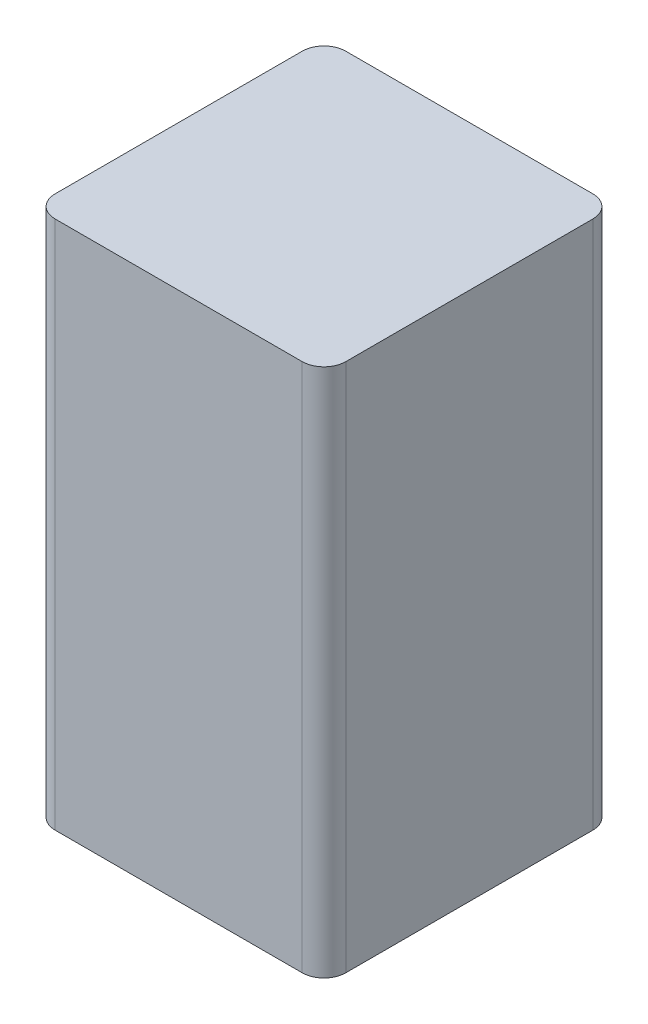
ISO-10303-21;
HEADER;
FILE_DESCRIPTION(('STEP AP214'),'2;1');
FILE_NAME('part.step','',(''),(''),'','','');
FILE_SCHEMA(('AUTOMOTIVE_DESIGN { 1 0 10303 214 1 1 1 1 }'));
ENDSEC;
DATA;
#1=APPLICATION_CONTEXT('core data for automotive mechanical design processes');
#2=APPLICATION_PROTOCOL_DEFINITION('international standard','automotive_design',2000,#1);
#3=PRODUCT_CONTEXT('',#1,'mechanical');
#4=PRODUCT('Part','Part','',(#3));
#5=PRODUCT_RELATED_PRODUCT_CATEGORY('part','',(#4));
#6=PRODUCT_DEFINITION_FORMATION('','',#4);
#7=PRODUCT_DEFINITION_CONTEXT('part definition',#1,'design');
#8=PRODUCT_DEFINITION('design','',#6,#7);
#9=PRODUCT_DEFINITION_SHAPE('','',#8);
#10=(LENGTH_UNIT() NAMED_UNIT(*) SI_UNIT(.MILLI.,.METRE.));
#11=(NAMED_UNIT(*) PLANE_ANGLE_UNIT() SI_UNIT($,.RADIAN.));
#12=(NAMED_UNIT(*) SI_UNIT($,.STERADIAN.) SOLID_ANGLE_UNIT());
#13=UNCERTAINTY_MEASURE_WITH_UNIT(LENGTH_MEASURE(1.E-05),#10,'distance_accuracy_value','');
#14=(GEOMETRIC_REPRESENTATION_CONTEXT(3) GLOBAL_UNCERTAINTY_ASSIGNED_CONTEXT((#13)) GLOBAL_UNIT_ASSIGNED_CONTEXT((#10,
#11,#12)) REPRESENTATION_CONTEXT('',''));
#15=CARTESIAN_POINT('',(0.,0.,0.));
#16=DIRECTION('',(0.,0.,1.));
#17=DIRECTION('',(1.,0.,0.));
#18=AXIS2_PLACEMENT_3D('',#15,#16,#17);
#19=CARTESIAN_POINT('',(0.,72.85,40.));
#20=DIRECTION('',(1.,0.,0.));
#21=DIRECTION('',(0.,0.,-1.));
#22=AXIS2_PLACEMENT_3D('',#19,#20,#21);
#23=PLANE('',#22);
#24=DIRECTION('',(0.,0.,-1.));
#25=VECTOR('',#24,1.);
#26=CARTESIAN_POINT('',(0.,72.85,40.));
#27=LINE('',#26,#25);
#28=CARTESIAN_POINT('',(0.,72.85,37.));
#29=VERTEX_POINT('',#28);
#30=CARTESIAN_POINT('',(0.,72.85,3.));
#31=VERTEX_POINT('',#30);
#32=EDGE_CURVE('E160',#29,#31,#27,.T.);
#33=ORIENTED_EDGE('',*,*,#32,.T.);
#34=DIRECTION('',(0.,-1.,0.));
#35=VECTOR('',#34,1.);
#36=CARTESIAN_POINT('',(0.,72.85,3.));
#37=LINE('',#36,#35);
#38=CARTESIAN_POINT('',(0.,0.,3.));
#39=VERTEX_POINT('',#38);
#40=EDGE_CURVE('E124',#31,#39,#37,.T.);
#41=ORIENTED_EDGE('',*,*,#40,.T.);
#42=DIRECTION('',(0.,0.,-1.));
#43=VECTOR('',#42,1.);
#44=CARTESIAN_POINT('',(0.,0.,40.));
#45=LINE('',#44,#43);
#46=CARTESIAN_POINT('',(0.,0.,37.));
#47=VERTEX_POINT('',#46);
#48=EDGE_CURVE('E109',#47,#39,#45,.T.);
#49=ORIENTED_EDGE('',*,*,#48,.F.);
#50=DIRECTION('',(0.,-1.,0.));
#51=VECTOR('',#50,1.);
#52=CARTESIAN_POINT('',(0.,72.85,37.));
#53=LINE('',#52,#51);
#54=EDGE_CURVE('E121',#47,#29,#53,.F.);
#55=ORIENTED_EDGE('',*,*,#54,.T.);
#56=EDGE_LOOP('',(#33,#41,#49,#55));
#57=FACE_BOUND('',#56,.T.);
#58=ADVANCED_FACE('F39',(#57),#23,.F.);
#59=CARTESIAN_POINT('',(0.,0.,40.));
#60=DIRECTION('',(0.,1.,0.));
#61=DIRECTION('',(0.,0.,1.));
#62=AXIS2_PLACEMENT_3D('',#59,#60,#61);
#63=PLANE('',#62);
#64=CARTESIAN_POINT('',(20.,0.,20.));
#65=DIRECTION('',(0.,-1.,0.));
#66=DIRECTION('',(0.,0.,-1.));
#67=AXIS2_PLACEMENT_3D('',#64,#65,#66);
#68=CIRCLE('',#67,4.15);
#69=CARTESIAN_POINT('',(20.,0.,15.85));
#70=VERTEX_POINT('',#69);
#71=EDGE_CURVE('E313',#70,#70,#68,.T.);
#72=ORIENTED_EDGE('',*,*,#71,.F.);
#73=EDGE_LOOP('',(#72));
#74=FACE_BOUND('',#73,.T.);
#75=ORIENTED_EDGE('',*,*,#48,.T.);
#76=CARTESIAN_POINT('',(3.,0.,3.));
#77=DIRECTION('',(0.,1.,0.));
#78=DIRECTION('',(0.,0.,1.));
#79=AXIS2_PLACEMENT_3D('',#76,#77,#78);
#80=CIRCLE('',#79,3.);
#81=CARTESIAN_POINT('',(3.,0.,0.));
#82=VERTEX_POINT('',#81);
#83=EDGE_CURVE('E136',#39,#82,#80,.F.);
#84=ORIENTED_EDGE('',*,*,#83,.T.);
#85=DIRECTION('',(1.,0.,0.));
#86=VECTOR('',#85,1.);
#87=CARTESIAN_POINT('',(0.,0.,0.));
#88=LINE('',#87,#86);
#89=CARTESIAN_POINT('',(37.,0.,0.));
#90=VERTEX_POINT('',#89);
#91=EDGE_CURVE('E168',#82,#90,#88,.T.);
#92=ORIENTED_EDGE('',*,*,#91,.T.);
#93=CARTESIAN_POINT('',(37.,0.,3.));
#94=DIRECTION('',(0.,1.,0.));
#95=DIRECTION('',(0.,0.,1.));
#96=AXIS2_PLACEMENT_3D('',#93,#94,#95);
#97=CIRCLE('',#96,3.);
#98=CARTESIAN_POINT('',(40.,0.,3.));
#99=VERTEX_POINT('',#98);
#100=EDGE_CURVE('E115',#90,#99,#97,.F.);
#101=ORIENTED_EDGE('',*,*,#100,.T.);
#102=DIRECTION('',(0.,0.,-1.));
#103=VECTOR('',#102,1.);
#104=CARTESIAN_POINT('',(40.,0.,40.));
#105=LINE('',#104,#103);
#106=CARTESIAN_POINT('',(40.,0.,37.));
#107=VERTEX_POINT('',#106);
#108=EDGE_CURVE('E125',#107,#99,#105,.T.);
#109=ORIENTED_EDGE('',*,*,#108,.F.);
#110=CARTESIAN_POINT('',(37.,0.,37.));
#111=DIRECTION('',(0.,1.,0.));
#112=DIRECTION('',(0.,0.,1.));
#113=AXIS2_PLACEMENT_3D('',#110,#111,#112);
#114=CIRCLE('',#113,3.);
#115=CARTESIAN_POINT('',(37.,0.,40.));
#116=VERTEX_POINT('',#115);
#117=EDGE_CURVE('E116',#107,#116,#114,.F.);
#118=ORIENTED_EDGE('',*,*,#117,.T.);
#119=DIRECTION('',(1.,0.,0.));
#120=VECTOR('',#119,1.);
#121=CARTESIAN_POINT('',(0.,0.,40.));
#122=LINE('',#121,#120);
#123=CARTESIAN_POINT('',(3.,0.,40.));
#124=VERTEX_POINT('',#123);
#125=EDGE_CURVE('E111',#124,#116,#122,.T.);
#126=ORIENTED_EDGE('',*,*,#125,.F.);
#127=CARTESIAN_POINT('',(3.,0.,37.));
#128=DIRECTION('',(0.,1.,0.));
#129=DIRECTION('',(0.,0.,1.));
#130=AXIS2_PLACEMENT_3D('',#127,#128,#129);
#131=CIRCLE('',#130,3.);
#132=EDGE_CURVE('E106',#124,#47,#131,.F.);
#133=ORIENTED_EDGE('',*,*,#132,.T.);
#134=EDGE_LOOP('',(#75,#84,#92,#101,#109,#118,#126,#133));
#135=FACE_BOUND('',#134,.T.);
#136=ADVANCED_FACE('F108',(#74,#135),#63,.F.);
#137=CARTESIAN_POINT('',(40.,0.,40.));
#138=DIRECTION('',(-1.,0.,0.));
#139=DIRECTION('',(0.,0.,1.));
#140=AXIS2_PLACEMENT_3D('',#137,#138,#139);
#141=PLANE('',#140);
#142=ORIENTED_EDGE('',*,*,#108,.T.);
#143=DIRECTION('',(0.,1.,0.));
#144=VECTOR('',#143,1.);
#145=CARTESIAN_POINT('',(40.,0.,3.));
#146=LINE('',#145,#144);
#147=CARTESIAN_POINT('',(40.,72.85,3.));
#148=VERTEX_POINT('',#147);
#149=EDGE_CURVE('E149',#99,#148,#146,.T.);
#150=ORIENTED_EDGE('',*,*,#149,.T.);
#151=DIRECTION('',(0.,0.,-1.));
#152=VECTOR('',#151,1.);
#153=CARTESIAN_POINT('',(40.,72.85,40.));
#154=LINE('',#153,#152);
#155=CARTESIAN_POINT('',(40.,72.85,37.));
#156=VERTEX_POINT('',#155);
#157=EDGE_CURVE('E162',#156,#148,#154,.T.);
#158=ORIENTED_EDGE('',*,*,#157,.F.);
#159=DIRECTION('',(0.,1.,0.));
#160=VECTOR('',#159,1.);
#161=CARTESIAN_POINT('',(40.,0.,37.));
#162=LINE('',#161,#160);
#163=EDGE_CURVE('E147',#156,#107,#162,.F.);
#164=ORIENTED_EDGE('',*,*,#163,.T.);
#165=EDGE_LOOP('',(#142,#150,#158,#164));
#166=FACE_BOUND('',#165,.T.);
#167=ADVANCED_FACE('F176',(#166),#141,.F.);
#168=CARTESIAN_POINT('',(40.,72.85,40.));
#169=DIRECTION('',(0.,-1.,0.));
#170=DIRECTION('',(0.,0.,-1.));
#171=AXIS2_PLACEMENT_3D('',#168,#169,#170);
#172=PLANE('',#171);
#173=DIRECTION('',(-1.,0.,0.));
#174=VECTOR('',#173,1.);
#175=CARTESIAN_POINT('',(40.,72.85,0.));
#176=LINE('',#175,#174);
#177=CARTESIAN_POINT('',(37.,72.85,0.));
#178=VERTEX_POINT('',#177);
#179=CARTESIAN_POINT('',(3.,72.85,0.));
#180=VERTEX_POINT('',#179);
#181=EDGE_CURVE('E164',#178,#180,#176,.T.);
#182=ORIENTED_EDGE('',*,*,#181,.T.);
#183=CARTESIAN_POINT('',(3.,72.85,3.));
#184=DIRECTION('',(0.,-1.,0.));
#185=DIRECTION('',(0.,0.,-1.));
#186=AXIS2_PLACEMENT_3D('',#183,#184,#185);
#187=CIRCLE('',#186,3.);
#188=EDGE_CURVE('E145',#180,#31,#187,.F.);
#189=ORIENTED_EDGE('',*,*,#188,.T.);
#190=ORIENTED_EDGE('',*,*,#32,.F.);
#191=CARTESIAN_POINT('',(3.,72.85,37.));
#192=DIRECTION('',(0.,-1.,0.));
#193=DIRECTION('',(0.,0.,-1.));
#194=AXIS2_PLACEMENT_3D('',#191,#192,#193);
#195=CIRCLE('',#194,3.);
#196=CARTESIAN_POINT('',(3.,72.85,40.));
#197=VERTEX_POINT('',#196);
#198=EDGE_CURVE('E129',#29,#197,#195,.F.);
#199=ORIENTED_EDGE('',*,*,#198,.T.);
#200=DIRECTION('',(-1.,0.,0.));
#201=VECTOR('',#200,1.);
#202=CARTESIAN_POINT('',(40.,72.85,40.));
#203=LINE('',#202,#201);
#204=CARTESIAN_POINT('',(37.,72.85,40.));
#205=VERTEX_POINT('',#204);
#206=EDGE_CURVE('E155',#205,#197,#203,.T.);
#207=ORIENTED_EDGE('',*,*,#206,.F.);
#208=CARTESIAN_POINT('',(37.,72.85,37.));
#209=DIRECTION('',(0.,-1.,0.));
#210=DIRECTION('',(0.,0.,-1.));
#211=AXIS2_PLACEMENT_3D('',#208,#209,#210);
#212=CIRCLE('',#211,3.);
#213=EDGE_CURVE('E62',#205,#156,#212,.F.);
#214=ORIENTED_EDGE('',*,*,#213,.T.);
#215=ORIENTED_EDGE('',*,*,#157,.T.);
#216=CARTESIAN_POINT('',(37.,72.85,3.));
#217=DIRECTION('',(0.,-1.,0.));
#218=DIRECTION('',(0.,0.,-1.));
#219=AXIS2_PLACEMENT_3D('',#216,#217,#218);
#220=CIRCLE('',#219,3.);
#221=EDGE_CURVE('E54',#148,#178,#220,.F.);
#222=ORIENTED_EDGE('',*,*,#221,.T.);
#223=EDGE_LOOP('',(#182,#189,#190,#199,#207,#214,#215,#222));
#224=FACE_BOUND('',#223,.T.);
#225=ADVANCED_FACE('F159',(#224),#172,.F.);
#226=CARTESIAN_POINT('',(0.,0.,40.));
#227=DIRECTION('',(0.,0.,1.));
#228=DIRECTION('',(1.,0.,0.));
#229=AXIS2_PLACEMENT_3D('',#226,#227,#228);
#230=PLANE('',#229);
#231=ORIENTED_EDGE('',*,*,#206,.T.);
#232=DIRECTION('',(0.,-1.,0.));
#233=VECTOR('',#232,1.);
#234=CARTESIAN_POINT('',(3.,0.,40.));
#235=LINE('',#234,#233);
#236=EDGE_CURVE('E11',#197,#124,#235,.T.);
#237=ORIENTED_EDGE('',*,*,#236,.T.);
#238=ORIENTED_EDGE('',*,*,#125,.T.);
#239=DIRECTION('',(0.,1.,0.));
#240=VECTOR('',#239,1.);
#241=CARTESIAN_POINT('',(37.,72.85,40.));
#242=LINE('',#241,#240);
#243=EDGE_CURVE('E47',#116,#205,#242,.T.);
#244=ORIENTED_EDGE('',*,*,#243,.T.);
#245=EDGE_LOOP('',(#231,#237,#238,#244));
#246=FACE_BOUND('',#245,.T.);
#247=ADVANCED_FACE('F154',(#246),#230,.T.);
#248=CARTESIAN_POINT('',(0.,0.,0.));
#249=DIRECTION('',(0.,0.,1.));
#250=DIRECTION('',(1.,0.,0.));
#251=AXIS2_PLACEMENT_3D('',#248,#249,#250);
#252=PLANE('',#251);
#253=ORIENTED_EDGE('',*,*,#91,.F.);
#254=DIRECTION('',(0.,-1.,0.));
#255=VECTOR('',#254,1.);
#256=CARTESIAN_POINT('',(3.,0.,0.));
#257=LINE('',#256,#255);
#258=EDGE_CURVE('E140',#82,#180,#257,.F.);
#259=ORIENTED_EDGE('',*,*,#258,.T.);
#260=ORIENTED_EDGE('',*,*,#181,.F.);
#261=DIRECTION('',(0.,1.,0.));
#262=VECTOR('',#261,1.);
#263=CARTESIAN_POINT('',(37.,0.,0.));
#264=LINE('',#263,#262);
#265=EDGE_CURVE('E138',#178,#90,#264,.F.);
#266=ORIENTED_EDGE('',*,*,#265,.T.);
#267=EDGE_LOOP('',(#253,#259,#260,#266));
#268=FACE_BOUND('',#267,.T.);
#269=ADVANCED_FACE('F183',(#268),#252,.F.);
#270=CARTESIAN_POINT('',(3.,72.85,3.));
#271=DIRECTION('',(0.,-1.,0.));
#272=DIRECTION('',(0.,0.,-1.));
#273=AXIS2_PLACEMENT_3D('',#270,#271,#272);
#274=CYLINDRICAL_SURFACE('',#273,3.);
#275=ORIENTED_EDGE('',*,*,#188,.F.);
#276=ORIENTED_EDGE('',*,*,#258,.F.);
#277=ORIENTED_EDGE('',*,*,#83,.F.);
#278=ORIENTED_EDGE('',*,*,#40,.F.);
#279=EDGE_LOOP('',(#275,#276,#277,#278));
#280=FACE_BOUND('',#279,.T.);
#281=ADVANCED_FACE('F187',(#280),#274,.T.);
#282=CARTESIAN_POINT('',(37.,0.,3.));
#283=DIRECTION('',(0.,1.,0.));
#284=DIRECTION('',(0.,0.,1.));
#285=AXIS2_PLACEMENT_3D('',#282,#283,#284);
#286=CYLINDRICAL_SURFACE('',#285,3.);
#287=ORIENTED_EDGE('',*,*,#100,.F.);
#288=ORIENTED_EDGE('',*,*,#265,.F.);
#289=ORIENTED_EDGE('',*,*,#221,.F.);
#290=ORIENTED_EDGE('',*,*,#149,.F.);
#291=EDGE_LOOP('',(#287,#288,#289,#290));
#292=FACE_BOUND('',#291,.T.);
#293=ADVANCED_FACE('F179',(#292),#286,.T.);
#294=CARTESIAN_POINT('',(3.,0.,37.));
#295=DIRECTION('',(0.,1.,0.));
#296=DIRECTION('',(0.,0.,1.));
#297=AXIS2_PLACEMENT_3D('',#294,#295,#296);
#298=CYLINDRICAL_SURFACE('',#297,3.);
#299=ORIENTED_EDGE('',*,*,#198,.F.);
#300=ORIENTED_EDGE('',*,*,#54,.F.);
#301=ORIENTED_EDGE('',*,*,#132,.F.);
#302=ORIENTED_EDGE('',*,*,#236,.F.);
#303=EDGE_LOOP('',(#299,#300,#301,#302));
#304=FACE_BOUND('',#303,.T.);
#305=ADVANCED_FACE('F128',(#304),#298,.T.);
#306=CARTESIAN_POINT('',(37.,0.,37.));
#307=DIRECTION('',(0.,-1.,0.));
#308=DIRECTION('',(0.,0.,-1.));
#309=AXIS2_PLACEMENT_3D('',#306,#307,#308);
#310=CYLINDRICAL_SURFACE('',#309,3.);
#311=ORIENTED_EDGE('',*,*,#117,.F.);
#312=ORIENTED_EDGE('',*,*,#163,.F.);
#313=ORIENTED_EDGE('',*,*,#213,.F.);
#314=ORIENTED_EDGE('',*,*,#243,.F.);
#315=EDGE_LOOP('',(#311,#312,#313,#314));
#316=FACE_BOUND('',#315,.T.);
#317=ADVANCED_FACE('F41',(#316),#310,.T.);
#318=CARTESIAN_POINT('',(20.,26.,20.));
#319=DIRECTION('',(0.,-1.,0.));
#320=DIRECTION('',(0.,0.,-1.));
#321=AXIS2_PLACEMENT_3D('',#318,#319,#320);
#322=CYLINDRICAL_SURFACE('',#321,4.15);
#323=CARTESIAN_POINT('',(20.,26.,20.));
#324=DIRECTION('',(0.,-1.,0.));
#325=DIRECTION('',(0.,0.,-1.));
#326=AXIS2_PLACEMENT_3D('',#323,#324,#325);
#327=CIRCLE('',#326,4.15);
#328=CARTESIAN_POINT('',(20.,26.,15.85));
#329=VERTEX_POINT('',#328);
#330=EDGE_CURVE('E171',#329,#329,#327,.T.);
#331=CARTESIAN_POINT('',(20.,26.,15.85));
#332=CARTESIAN_POINT('',(20.,25.7291666666667,15.85));
#333=CARTESIAN_POINT('',(20.,25.4583333333333,15.85));
#334=CARTESIAN_POINT('',(20.,24.9166666666667,15.85));
#335=CARTESIAN_POINT('',(20.,24.6458333333333,15.85));
#336=CARTESIAN_POINT('',(20.,24.1041666666667,15.85));
#337=CARTESIAN_POINT('',(20.,23.8333333333333,15.85));
#338=CARTESIAN_POINT('',(20.,23.2916666666667,15.85));
#339=CARTESIAN_POINT('',(20.,23.0208333333333,15.85));
#340=CARTESIAN_POINT('',(20.,22.4791666666667,15.85));
#341=CARTESIAN_POINT('',(20.,22.2083333333333,15.85));
#342=CARTESIAN_POINT('',(20.,21.6666666666667,15.85));
#343=CARTESIAN_POINT('',(20.,21.3958333333333,15.85));
#344=CARTESIAN_POINT('',(20.,20.8541666666667,15.85));
#345=CARTESIAN_POINT('',(20.,20.5833333333333,15.85));
#346=CARTESIAN_POINT('',(20.,20.0416666666667,15.85));
#347=CARTESIAN_POINT('',(20.,19.7708333333333,15.85));
#348=CARTESIAN_POINT('',(20.,19.2291666666667,15.85));
#349=CARTESIAN_POINT('',(20.,18.9583333333333,15.85));
#350=CARTESIAN_POINT('',(20.,18.4166666666667,15.85));
#351=CARTESIAN_POINT('',(20.,18.1458333333333,15.85));
#352=CARTESIAN_POINT('',(20.,17.6041666666667,15.85));
#353=CARTESIAN_POINT('',(20.,17.3333333333333,15.85));
#354=CARTESIAN_POINT('',(20.,16.7916666666667,15.85));
#355=CARTESIAN_POINT('',(20.,16.5208333333333,15.85));
#356=CARTESIAN_POINT('',(20.,15.9791666666667,15.85));
#357=CARTESIAN_POINT('',(20.,15.7083333333333,15.85));
#358=CARTESIAN_POINT('',(20.,15.1666666666667,15.85));
#359=CARTESIAN_POINT('',(20.,14.8958333333333,15.85));
#360=CARTESIAN_POINT('',(20.,14.3541666666667,15.85));
#361=CARTESIAN_POINT('',(20.,14.0833333333333,15.85));
#362=CARTESIAN_POINT('',(20.,13.5416666666667,15.85));
#363=CARTESIAN_POINT('',(20.,13.2708333333333,15.85));
#364=CARTESIAN_POINT('',(20.,12.7291666666667,15.85));
#365=CARTESIAN_POINT('',(20.,12.4583333333333,15.85));
#366=CARTESIAN_POINT('',(20.,11.9166666666667,15.85));
#367=CARTESIAN_POINT('',(20.,11.6458333333333,15.85));
#368=CARTESIAN_POINT('',(20.,11.1041666666667,15.85));
#369=CARTESIAN_POINT('',(20.,10.8333333333333,15.85));
#370=CARTESIAN_POINT('',(20.,10.2916666666667,15.85));
#371=CARTESIAN_POINT('',(20.,10.0208333333333,15.85));
#372=CARTESIAN_POINT('',(20.,9.47916666666667,15.85));
#373=CARTESIAN_POINT('',(20.,9.20833333333333,15.85));
#374=CARTESIAN_POINT('',(20.,8.66666666666667,15.85));
#375=CARTESIAN_POINT('',(20.,8.39583333333333,15.85));
#376=CARTESIAN_POINT('',(20.,7.85416666666667,15.85));
#377=CARTESIAN_POINT('',(20.,7.58333333333333,15.85));
#378=CARTESIAN_POINT('',(20.,7.04166666666667,15.85));
#379=CARTESIAN_POINT('',(20.,6.77083333333334,15.85));
#380=CARTESIAN_POINT('',(20.,6.22916666666667,15.85));
#381=CARTESIAN_POINT('',(20.,5.95833333333334,15.85));
#382=CARTESIAN_POINT('',(20.,5.41666666666667,15.85));
#383=CARTESIAN_POINT('',(20.,5.14583333333333,15.85));
#384=CARTESIAN_POINT('',(20.,4.60416666666667,15.85));
#385=CARTESIAN_POINT('',(20.,4.33333333333333,15.85));
#386=CARTESIAN_POINT('',(20.,3.79166666666667,15.85));
#387=CARTESIAN_POINT('',(20.,3.52083333333333,15.85));
#388=CARTESIAN_POINT('',(20.,2.97916666666667,15.85));
#389=CARTESIAN_POINT('',(20.,2.70833333333333,15.85));
#390=CARTESIAN_POINT('',(20.,2.16666666666667,15.85));
#391=CARTESIAN_POINT('',(20.,1.89583333333333,15.85));
#392=CARTESIAN_POINT('',(20.,1.35416666666667,15.85));
#393=CARTESIAN_POINT('',(20.,1.08333333333333,15.85));
#394=CARTESIAN_POINT('',(20.,0.541666666666667,15.85));
#395=CARTESIAN_POINT('',(20.,0.270833333333333,15.85));
#396=CARTESIAN_POINT('',(20.,0.,15.85));
#397=B_SPLINE_CURVE_WITH_KNOTS('',3,(#331,#332,#333,#334,#335,#336,#337,#338,#339,#340,#341,
#342,#343,#344,#345,#346,#347,#348,#349,#350,#351,#352,#353,#354,#355,#356,#357,#358,#359,#360,
#361,#362,#363,#364,#365,#366,#367,#368,#369,#370,#371,#372,#373,#374,#375,#376,#377,#378,#379,
#380,#381,#382,#383,#384,#385,#386,#387,#388,#389,#390,#391,#392,#393,#394,#395,#396),
.UNSPECIFIED.,.F.,.F.,(4,2,2,2,2,2,2,2,2,2,2,2,2,2,2,2,2,2,2,2,2,2,2,2,2,2,2,2,2,2,2,2,4),(0.,
0.812500000000001,1.625,2.4375,3.25,4.0625,4.875,5.6875,6.5,7.3125,8.125,8.9375,9.75,10.5625,
11.375,12.1875,13.,13.8125,14.625,15.4375,16.25,17.0625,17.875,18.6875,19.5,20.3125,21.125,
21.9375,22.75,23.5625,24.375,25.1875,26.),.UNSPECIFIED.);
#398=EDGE_CURVE('BSEAM189',#329,#70,#397,.T.);
#399=ORIENTED_EDGE('',*,*,#330,.F.);
#400=ORIENTED_EDGE('',*,*,#71,.T.);
#401=ORIENTED_EDGE('',*,*,#398,.T.);
#402=ORIENTED_EDGE('',*,*,#398,.F.);
#403=EDGE_LOOP('',(#399,#401,#400,#402));
#404=FACE_BOUND('',#403,.T.);
#405=ADVANCED_FACE('F189',(#404),#322,.F.);
#406=CARTESIAN_POINT('',(20.,26.,20.));
#407=DIRECTION('',(0.,-1.,0.));
#408=DIRECTION('',(0.,0.,-1.));
#409=AXIS2_PLACEMENT_3D('',#406,#407,#408);
#410=PLANE('',#409);
#411=ORIENTED_EDGE('',*,*,#330,.T.);
#412=EDGE_LOOP('',(#411));
#413=FACE_BOUND('',#412,.T.);
#414=ADVANCED_FACE('F194',(#413),#410,.T.);
#415=CLOSED_SHELL('',(#58,#136,#167,#225,#247,#269,#281,#293,#305,#317,#405,#414));
#416=MANIFOLD_SOLID_BREP('B2',#415);
#417=ADVANCED_BREP_SHAPE_REPRESENTATION('',(#18,#416),#14);
#418=SHAPE_DEFINITION_REPRESENTATION(#9,#417);
ENDSEC;
END-ISO-10303-21;
